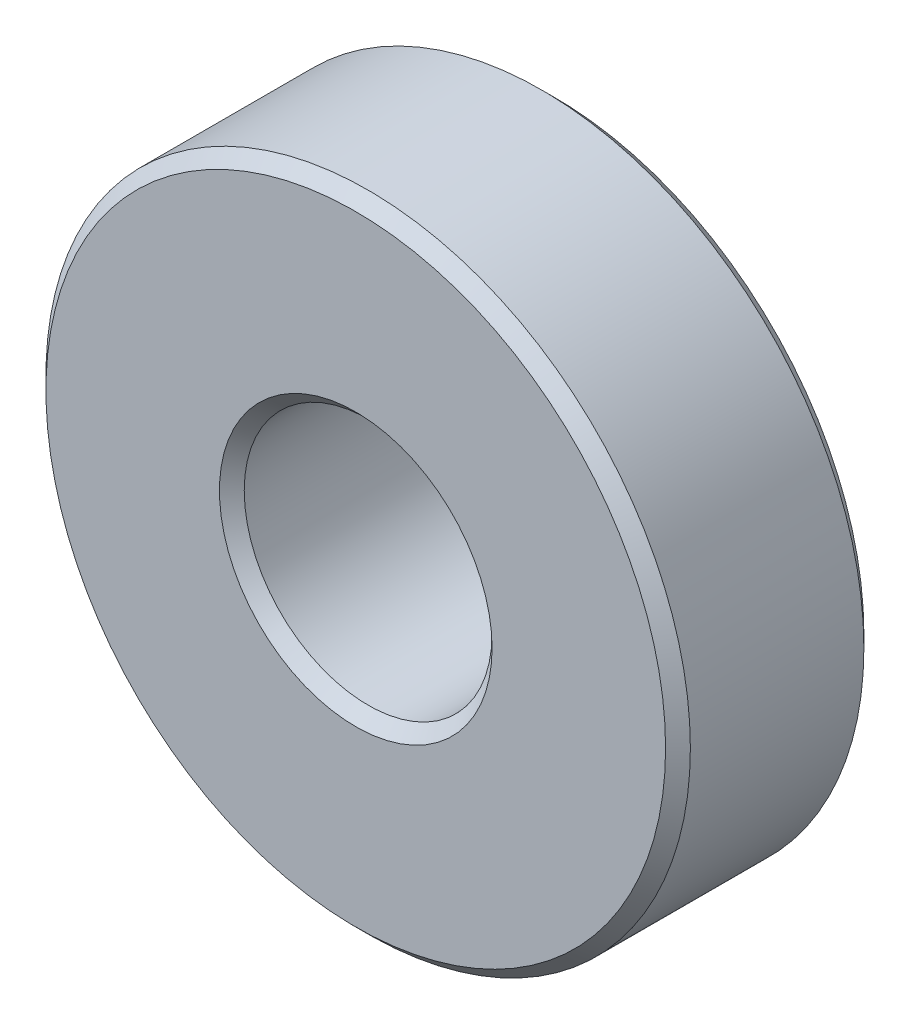
ISO-10303-21;
HEADER;
FILE_DESCRIPTION(('STEP AP214'),'2;1');
FILE_NAME('part.step','',(''),(''),'','','');
FILE_SCHEMA(('AUTOMOTIVE_DESIGN { 1 0 10303 214 1 1 1 1 }'));
ENDSEC;
DATA;
#1=APPLICATION_CONTEXT('core data for automotive mechanical design processes');
#2=APPLICATION_PROTOCOL_DEFINITION('international standard','automotive_design',2000,#1);
#3=PRODUCT_CONTEXT('',#1,'mechanical');
#4=PRODUCT('Part','Part','',(#3));
#5=PRODUCT_RELATED_PRODUCT_CATEGORY('part','',(#4));
#6=PRODUCT_DEFINITION_FORMATION('','',#4);
#7=PRODUCT_DEFINITION_CONTEXT('part definition',#1,'design');
#8=PRODUCT_DEFINITION('design','',#6,#7);
#9=PRODUCT_DEFINITION_SHAPE('','',#8);
#10=(LENGTH_UNIT() NAMED_UNIT(*) SI_UNIT(.MILLI.,.METRE.));
#11=(NAMED_UNIT(*) PLANE_ANGLE_UNIT() SI_UNIT($,.RADIAN.));
#12=(NAMED_UNIT(*) SI_UNIT($,.STERADIAN.) SOLID_ANGLE_UNIT());
#13=UNCERTAINTY_MEASURE_WITH_UNIT(LENGTH_MEASURE(1.E-05),#10,'distance_accuracy_value','');
#14=(GEOMETRIC_REPRESENTATION_CONTEXT(3) GLOBAL_UNCERTAINTY_ASSIGNED_CONTEXT((#13)) GLOBAL_UNIT_ASSIGNED_CONTEXT((#10,
#11,#12)) REPRESENTATION_CONTEXT('',''));
#15=CARTESIAN_POINT('',(0.,0.,0.));
#16=DIRECTION('',(0.,0.,1.));
#17=DIRECTION('',(1.,0.,0.));
#18=AXIS2_PLACEMENT_3D('',#15,#16,#17);
#19=CARTESIAN_POINT('',(0.,0.,8.));
#20=DIRECTION('',(0.,0.,-1.));
#21=DIRECTION('',(-1.,0.,0.));
#22=AXIS2_PLACEMENT_3D('',#19,#20,#21);
#23=CYLINDRICAL_SURFACE('',#22,13.);
#24=CARTESIAN_POINT('',(0.,0.,0.500000000000007));
#25=DIRECTION('',(0.,0.,1.));
#26=DIRECTION('',(1.,0.,0.));
#27=AXIS2_PLACEMENT_3D('',#24,#25,#26);
#28=CIRCLE('',#27,13.);
#29=CARTESIAN_POINT('',(13.,0.,0.500000000000007));
#30=VERTEX_POINT('',#29);
#31=EDGE_CURVE('E42',#30,#30,#28,.T.);
#32=ORIENTED_EDGE('',*,*,#31,.T.);
#33=EDGE_LOOP('',(#32));
#34=FACE_BOUND('',#33,.T.);
#35=CARTESIAN_POINT('',(0.,0.,7.5));
#36=DIRECTION('',(0.,0.,1.));
#37=DIRECTION('',(1.,0.,0.));
#38=AXIS2_PLACEMENT_3D('',#35,#36,#37);
#39=CIRCLE('',#38,13.);
#40=CARTESIAN_POINT('',(13.,0.,7.5));
#41=VERTEX_POINT('',#40);
#42=EDGE_CURVE('E46',#41,#41,#39,.F.);
#43=ORIENTED_EDGE('',*,*,#42,.T.);
#44=EDGE_LOOP('',(#43));
#45=FACE_BOUND('',#44,.T.);
#46=ADVANCED_FACE('F31',(#34,#45),#23,.T.);
#47=CARTESIAN_POINT('',(0.,0.,8.));
#48=DIRECTION('',(0.,0.,1.));
#49=DIRECTION('',(1.,0.,0.));
#50=AXIS2_PLACEMENT_3D('',#47,#48,#49);
#51=PLANE('',#50);
#52=CARTESIAN_POINT('',(0.,0.,8.));
#53=DIRECTION('',(0.,0.,1.));
#54=DIRECTION('',(1.,0.,0.));
#55=AXIS2_PLACEMENT_3D('',#52,#53,#54);
#56=CIRCLE('',#55,5.5);
#57=CARTESIAN_POINT('',(5.5,0.,8.));
#58=VERTEX_POINT('',#57);
#59=EDGE_CURVE('E10',#58,#58,#56,.F.);
#60=ORIENTED_EDGE('',*,*,#59,.T.);
#61=EDGE_LOOP('',(#60));
#62=FACE_BOUND('',#61,.T.);
#63=CARTESIAN_POINT('',(0.,0.,8.));
#64=DIRECTION('',(0.,0.,1.));
#65=DIRECTION('',(1.,0.,0.));
#66=AXIS2_PLACEMENT_3D('',#63,#64,#65);
#67=CIRCLE('',#66,12.5);
#68=CARTESIAN_POINT('',(12.5,0.,8.));
#69=VERTEX_POINT('',#68);
#70=EDGE_CURVE('E38',#69,#69,#67,.T.);
#71=ORIENTED_EDGE('',*,*,#70,.T.);
#72=EDGE_LOOP('',(#71));
#73=FACE_BOUND('',#72,.T.);
#74=ADVANCED_FACE('F76',(#62,#73),#51,.T.);
#75=CARTESIAN_POINT('',(0.,0.,0.));
#76=DIRECTION('',(0.,0.,1.));
#77=DIRECTION('',(1.,0.,0.));
#78=AXIS2_PLACEMENT_3D('',#75,#76,#77);
#79=PLANE('',#78);
#80=CARTESIAN_POINT('',(0.,0.,0.));
#81=DIRECTION('',(0.,0.,1.));
#82=DIRECTION('',(1.,0.,0.));
#83=AXIS2_PLACEMENT_3D('',#80,#81,#82);
#84=CIRCLE('',#83,5.5);
#85=CARTESIAN_POINT('',(5.5,0.,0.));
#86=VERTEX_POINT('',#85);
#87=EDGE_CURVE('E57',#86,#86,#84,.T.);
#88=ORIENTED_EDGE('',*,*,#87,.T.);
#89=EDGE_LOOP('',(#88));
#90=FACE_BOUND('',#89,.T.);
#91=CARTESIAN_POINT('',(0.,0.,0.));
#92=DIRECTION('',(0.,0.,1.));
#93=DIRECTION('',(1.,0.,0.));
#94=AXIS2_PLACEMENT_3D('',#91,#92,#93);
#95=CIRCLE('',#94,12.5);
#96=CARTESIAN_POINT('',(12.5,0.,0.));
#97=VERTEX_POINT('',#96);
#98=EDGE_CURVE('E60',#97,#97,#95,.F.);
#99=ORIENTED_EDGE('',*,*,#98,.T.);
#100=EDGE_LOOP('',(#99));
#101=FACE_BOUND('',#100,.T.);
#102=ADVANCED_FACE('F64',(#90,#101),#79,.F.);
#103=CARTESIAN_POINT('',(0.,0.,0.));
#104=DIRECTION('',(0.,0.,1.));
#105=DIRECTION('',(1.,0.,0.));
#106=AXIS2_PLACEMENT_3D('',#103,#104,#105);
#107=CYLINDRICAL_SURFACE('',#106,5.);
#108=CARTESIAN_POINT('',(0.,0.,0.499999999999998));
#109=DIRECTION('',(0.,0.,1.));
#110=DIRECTION('',(1.,0.,0.));
#111=AXIS2_PLACEMENT_3D('',#108,#109,#110);
#112=CIRCLE('',#111,5.);
#113=CARTESIAN_POINT('',(5.,0.,0.499999999999998));
#114=VERTEX_POINT('',#113);
#115=EDGE_CURVE('E51',#114,#114,#112,.F.);
#116=ORIENTED_EDGE('',*,*,#115,.T.);
#117=EDGE_LOOP('',(#116));
#118=FACE_BOUND('',#117,.T.);
#119=CARTESIAN_POINT('',(0.,0.,7.5));
#120=DIRECTION('',(0.,0.,1.));
#121=DIRECTION('',(1.,0.,0.));
#122=AXIS2_PLACEMENT_3D('',#119,#120,#121);
#123=CIRCLE('',#122,5.);
#124=CARTESIAN_POINT('',(5.,0.,7.5));
#125=VERTEX_POINT('',#124);
#126=EDGE_CURVE('E54',#125,#125,#123,.T.);
#127=ORIENTED_EDGE('',*,*,#126,.T.);
#128=EDGE_LOOP('',(#127));
#129=FACE_BOUND('',#128,.T.);
#130=ADVANCED_FACE('F91',(#118,#129),#107,.F.);
#131=CARTESIAN_POINT('',(0.,0.,0.));
#132=DIRECTION('',(0.,0.,-1.));
#133=DIRECTION('',(-1.,0.,0.));
#134=AXIS2_PLACEMENT_3D('',#131,#132,#133);
#135=CONICAL_SURFACE('',#134,5.5,0.785398163397448);
#136=ORIENTED_EDGE('',*,*,#115,.F.);
#137=EDGE_LOOP('',(#136));
#138=FACE_BOUND('',#137,.T.);
#139=ORIENTED_EDGE('',*,*,#87,.F.);
#140=EDGE_LOOP('',(#139));
#141=FACE_BOUND('',#140,.T.);
#142=ADVANCED_FACE('F70',(#138,#141),#135,.F.);
#143=CARTESIAN_POINT('',(0.,0.,0.500000000000007));
#144=DIRECTION('',(0.,0.,1.));
#145=DIRECTION('',(1.,0.,0.));
#146=AXIS2_PLACEMENT_3D('',#143,#144,#145);
#147=CONICAL_SURFACE('',#146,13.,0.785398163397452);
#148=ORIENTED_EDGE('',*,*,#98,.F.);
#149=EDGE_LOOP('',(#148));
#150=FACE_BOUND('',#149,.T.);
#151=ORIENTED_EDGE('',*,*,#31,.F.);
#152=EDGE_LOOP('',(#151));
#153=FACE_BOUND('',#152,.T.);
#154=ADVANCED_FACE('F66',(#150,#153),#147,.T.);
#155=CARTESIAN_POINT('',(0.,0.,7.5));
#156=DIRECTION('',(0.,0.,1.));
#157=DIRECTION('',(1.,0.,0.));
#158=AXIS2_PLACEMENT_3D('',#155,#156,#157);
#159=CONICAL_SURFACE('',#158,5.,0.785398163397448);
#160=ORIENTED_EDGE('',*,*,#59,.F.);
#161=EDGE_LOOP('',(#160));
#162=FACE_BOUND('',#161,.T.);
#163=ORIENTED_EDGE('',*,*,#126,.F.);
#164=EDGE_LOOP('',(#163));
#165=FACE_BOUND('',#164,.T.);
#166=ADVANCED_FACE('F69',(#162,#165),#159,.F.);
#167=CARTESIAN_POINT('',(0.,0.,8.));
#168=DIRECTION('',(0.,0.,-1.));
#169=DIRECTION('',(-1.,0.,0.));
#170=AXIS2_PLACEMENT_3D('',#167,#168,#169);
#171=CONICAL_SURFACE('',#170,12.5,0.78539816339745);
#172=ORIENTED_EDGE('',*,*,#42,.F.);
#173=EDGE_LOOP('',(#172));
#174=FACE_BOUND('',#173,.T.);
#175=ORIENTED_EDGE('',*,*,#70,.F.);
#176=EDGE_LOOP('',(#175));
#177=FACE_BOUND('',#176,.T.);
#178=ADVANCED_FACE('F33',(#174,#177),#171,.T.);
#179=CLOSED_SHELL('',(#46,#74,#102,#130,#142,#154,#166,#178));
#180=MANIFOLD_SOLID_BREP('B2',#179);
#181=ADVANCED_BREP_SHAPE_REPRESENTATION('',(#18,#180),#14);
#182=SHAPE_DEFINITION_REPRESENTATION(#9,#181);
ENDSEC;
END-ISO-10303-21;
